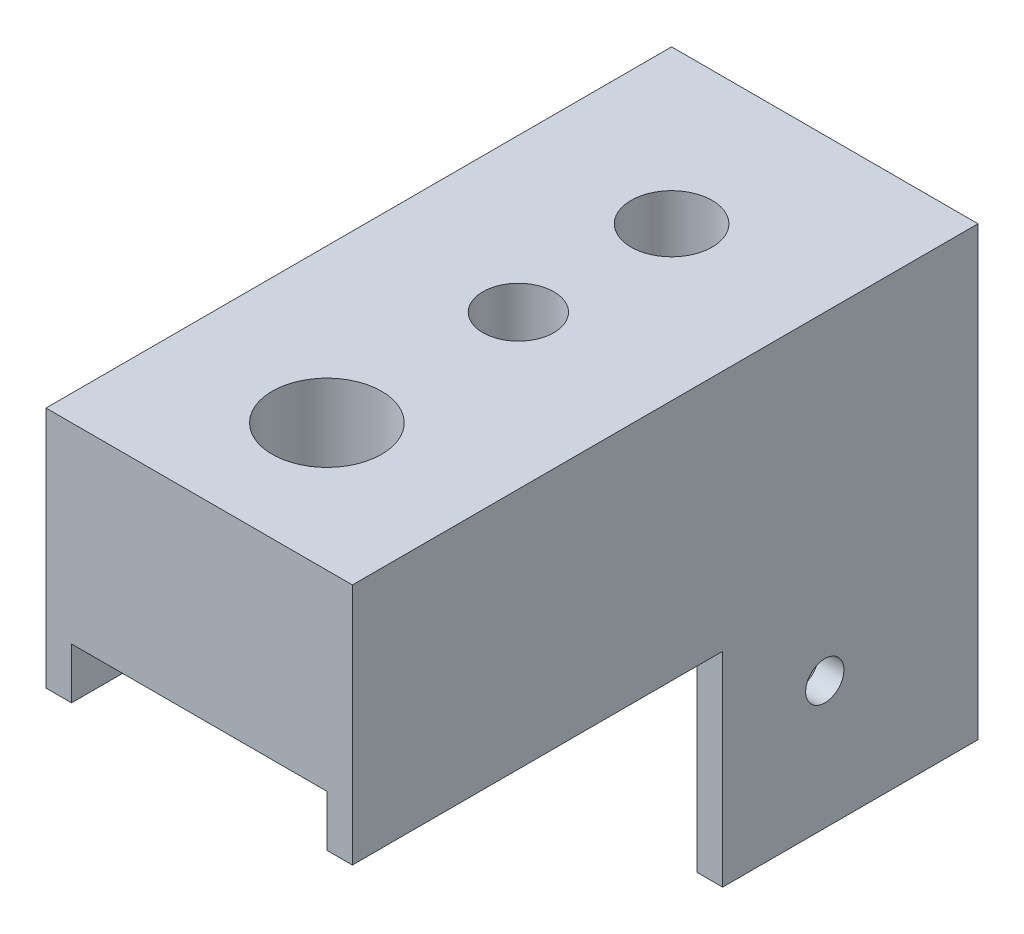
ISO-10303-21;
HEADER;
FILE_DESCRIPTION(('STEP AP214'),'2;1');
FILE_NAME('part.step','',(''),(''),'','','');
FILE_SCHEMA(('AUTOMOTIVE_DESIGN { 1 0 10303 214 1 1 1 1 }'));
ENDSEC;
DATA;
#1=APPLICATION_CONTEXT('core data for automotive mechanical design processes');
#2=APPLICATION_PROTOCOL_DEFINITION('international standard','automotive_design',2000,#1);
#3=PRODUCT_CONTEXT('',#1,'mechanical');
#4=PRODUCT('Part','Part','',(#3));
#5=PRODUCT_RELATED_PRODUCT_CATEGORY('part','',(#4));
#6=PRODUCT_DEFINITION_FORMATION('','',#4);
#7=PRODUCT_DEFINITION_CONTEXT('part definition',#1,'design');
#8=PRODUCT_DEFINITION('design','',#6,#7);
#9=PRODUCT_DEFINITION_SHAPE('','',#8);
#10=(LENGTH_UNIT() NAMED_UNIT(*) SI_UNIT(.MILLI.,.METRE.));
#11=(NAMED_UNIT(*) PLANE_ANGLE_UNIT() SI_UNIT($,.RADIAN.));
#12=(NAMED_UNIT(*) SI_UNIT($,.STERADIAN.) SOLID_ANGLE_UNIT());
#13=UNCERTAINTY_MEASURE_WITH_UNIT(LENGTH_MEASURE(1.E-05),#10,'distance_accuracy_value','');
#14=(GEOMETRIC_REPRESENTATION_CONTEXT(3) GLOBAL_UNCERTAINTY_ASSIGNED_CONTEXT((#13)) GLOBAL_UNIT_ASSIGNED_CONTEXT((#10,
#11,#12)) REPRESENTATION_CONTEXT('',''));
#15=CARTESIAN_POINT('',(0.,0.,0.));
#16=DIRECTION('',(0.,0.,1.));
#17=DIRECTION('',(1.,0.,0.));
#18=AXIS2_PLACEMENT_3D('',#15,#16,#17);
#19=CARTESIAN_POINT('',(10.,0.,44.));
#20=DIRECTION('',(0.,0.,-1.));
#21=DIRECTION('',(-1.,0.,0.));
#22=AXIS2_PLACEMENT_3D('',#19,#20,#21);
#23=PLANE('',#22);
#24=DIRECTION('',(-1.,0.,0.));
#25=VECTOR('',#24,1.);
#26=CARTESIAN_POINT('',(10.,15.,44.));
#27=LINE('',#26,#25);
#28=CARTESIAN_POINT('',(12.,15.,44.));
#29=VERTEX_POINT('',#28);
#30=CARTESIAN_POINT('',(-12.,15.,44.));
#31=VERTEX_POINT('',#30);
#32=EDGE_CURVE('E142',#29,#31,#27,.T.);
#33=ORIENTED_EDGE('',*,*,#32,.T.);
#34=DIRECTION('',(0.,-1.,0.));
#35=VECTOR('',#34,1.);
#36=CARTESIAN_POINT('',(-12.,15.,44.));
#37=LINE('',#36,#35);
#38=CARTESIAN_POINT('',(-12.,-4.,44.));
#39=VERTEX_POINT('',#38);
#40=EDGE_CURVE('E134',#31,#39,#37,.T.);
#41=ORIENTED_EDGE('',*,*,#40,.T.);
#42=DIRECTION('',(1.,0.,0.));
#43=VECTOR('',#42,1.);
#44=CARTESIAN_POINT('',(-12.,-4.,44.));
#45=LINE('',#44,#43);
#46=CARTESIAN_POINT('',(-10.,-4.,44.));
#47=VERTEX_POINT('',#46);
#48=EDGE_CURVE('E117',#39,#47,#45,.T.);
#49=ORIENTED_EDGE('',*,*,#48,.T.);
#50=DIRECTION('',(0.,-1.,0.));
#51=VECTOR('',#50,1.);
#52=CARTESIAN_POINT('',(-10.,15.,44.));
#53=LINE('',#52,#51);
#54=CARTESIAN_POINT('',(-10.,0.,44.));
#55=VERTEX_POINT('',#54);
#56=EDGE_CURVE('E157',#55,#47,#53,.T.);
#57=ORIENTED_EDGE('',*,*,#56,.F.);
#58=DIRECTION('',(-1.,0.,0.));
#59=VECTOR('',#58,1.);
#60=CARTESIAN_POINT('',(10.,0.,44.));
#61=LINE('',#60,#59);
#62=CARTESIAN_POINT('',(10.,0.,44.));
#63=VERTEX_POINT('',#62);
#64=EDGE_CURVE('E11',#63,#55,#61,.T.);
#65=ORIENTED_EDGE('',*,*,#64,.F.);
#66=DIRECTION('',(0.,-1.,0.));
#67=VECTOR('',#66,1.);
#68=CARTESIAN_POINT('',(10.,15.,44.));
#69=LINE('',#68,#67);
#70=CARTESIAN_POINT('',(10.,-4.,44.));
#71=VERTEX_POINT('',#70);
#72=EDGE_CURVE('E170',#63,#71,#69,.T.);
#73=ORIENTED_EDGE('',*,*,#72,.T.);
#74=DIRECTION('',(-1.,0.,0.));
#75=VECTOR('',#74,1.);
#76=CARTESIAN_POINT('',(12.,-4.,44.));
#77=LINE('',#76,#75);
#78=CARTESIAN_POINT('',(12.,-4.,44.));
#79=VERTEX_POINT('',#78);
#80=EDGE_CURVE('E183',#79,#71,#77,.T.);
#81=ORIENTED_EDGE('',*,*,#80,.F.);
#82=DIRECTION('',(0.,-1.,0.));
#83=VECTOR('',#82,1.);
#84=CARTESIAN_POINT('',(12.,15.,44.));
#85=LINE('',#84,#83);
#86=EDGE_CURVE('E181',#29,#79,#85,.T.);
#87=ORIENTED_EDGE('',*,*,#86,.F.);
#88=EDGE_LOOP('',(#33,#41,#49,#57,#65,#73,#81,#87));
#89=FACE_BOUND('',#88,.T.);
#90=ADVANCED_FACE('F33',(#89),#23,.F.);
#91=CARTESIAN_POINT('',(10.,0.,44.));
#92=DIRECTION('',(0.,1.,0.));
#93=DIRECTION('',(0.,0.,1.));
#94=AXIS2_PLACEMENT_3D('',#91,#92,#93);
#95=PLANE('',#94);
#96=CARTESIAN_POINT('',(0.,0.,34.));
#97=DIRECTION('',(0.,-1.,0.));
#98=DIRECTION('',(0.,0.,-1.));
#99=AXIS2_PLACEMENT_3D('',#96,#97,#98);
#100=CIRCLE('',#99,4.285);
#101=CARTESIAN_POINT('',(0.,0.,29.715));
#102=VERTEX_POINT('',#101);
#103=EDGE_CURVE('E313',#102,#102,#100,.T.);
#104=ORIENTED_EDGE('',*,*,#103,.F.);
#105=EDGE_LOOP('',(#104));
#106=FACE_BOUND('',#105,.T.);
#107=CARTESIAN_POINT('',(0.,0.,19.));
#108=DIRECTION('',(0.,-1.,0.));
#109=DIRECTION('',(0.,0.,-1.));
#110=AXIS2_PLACEMENT_3D('',#107,#108,#109);
#111=CIRCLE('',#110,2.78);
#112=CARTESIAN_POINT('',(0.,0.,16.22));
#113=VERTEX_POINT('',#112);
#114=EDGE_CURVE('E319',#113,#113,#111,.T.);
#115=ORIENTED_EDGE('',*,*,#114,.F.);
#116=EDGE_LOOP('',(#115));
#117=FACE_BOUND('',#116,.T.);
#118=CARTESIAN_POINT('',(0.,0.,7.));
#119=DIRECTION('',(0.,-1.,0.));
#120=DIRECTION('',(0.,0.,-1.));
#121=AXIS2_PLACEMENT_3D('',#118,#119,#120);
#122=CIRCLE('',#121,3.175);
#123=CARTESIAN_POINT('',(0.,0.,3.825));
#124=VERTEX_POINT('',#123);
#125=EDGE_CURVE('E310',#124,#124,#122,.T.);
#126=ORIENTED_EDGE('',*,*,#125,.F.);
#127=EDGE_LOOP('',(#126));
#128=FACE_BOUND('',#127,.T.);
#129=DIRECTION('',(0.,0.,-1.));
#130=VECTOR('',#129,1.);
#131=CARTESIAN_POINT('',(-10.,0.,44.));
#132=LINE('',#131,#130);
#133=CARTESIAN_POINT('',(-10.,0.,0.));
#134=VERTEX_POINT('',#133);
#135=EDGE_CURVE('E200',#55,#134,#132,.T.);
#136=ORIENTED_EDGE('',*,*,#135,.T.);
#137=DIRECTION('',(-1.,0.,0.));
#138=VECTOR('',#137,1.);
#139=CARTESIAN_POINT('',(10.,0.,0.));
#140=LINE('',#139,#138);
#141=CARTESIAN_POINT('',(10.,0.,0.));
#142=VERTEX_POINT('',#141);
#143=EDGE_CURVE('E41',#142,#134,#140,.T.);
#144=ORIENTED_EDGE('',*,*,#143,.F.);
#145=DIRECTION('',(0.,0.,-1.));
#146=VECTOR('',#145,1.);
#147=CARTESIAN_POINT('',(10.,0.,44.));
#148=LINE('',#147,#146);
#149=EDGE_CURVE('E201',#63,#142,#148,.T.);
#150=ORIENTED_EDGE('',*,*,#149,.F.);
#151=ORIENTED_EDGE('',*,*,#64,.T.);
#152=EDGE_LOOP('',(#136,#144,#150,#151));
#153=FACE_BOUND('',#152,.T.);
#154=ADVANCED_FACE('F224',(#106,#117,#128,#153),#95,.F.);
#155=CARTESIAN_POINT('',(10.,0.,0.));
#156=DIRECTION('',(0.,0.,-1.));
#157=DIRECTION('',(0.,1.,0.));
#158=AXIS2_PLACEMENT_3D('',#155,#156,#157);
#159=PLANE('',#158);
#160=DIRECTION('',(0.,-1.,0.));
#161=VECTOR('',#160,1.);
#162=CARTESIAN_POINT('',(-10.,0.,0.));
#163=LINE('',#162,#161);
#164=CARTESIAN_POINT('',(-10.,-20.,0.));
#165=VERTEX_POINT('',#164);
#166=EDGE_CURVE('E205',#134,#165,#163,.T.);
#167=ORIENTED_EDGE('',*,*,#166,.T.);
#168=DIRECTION('',(-1.,0.,0.));
#169=VECTOR('',#168,1.);
#170=CARTESIAN_POINT('',(10.,-20.,0.));
#171=LINE('',#170,#169);
#172=CARTESIAN_POINT('',(10.,-20.,0.));
#173=VERTEX_POINT('',#172);
#174=EDGE_CURVE('E216',#173,#165,#171,.T.);
#175=ORIENTED_EDGE('',*,*,#174,.F.);
#176=DIRECTION('',(0.,-1.,0.));
#177=VECTOR('',#176,1.);
#178=CARTESIAN_POINT('',(10.,0.,0.));
#179=LINE('',#178,#177);
#180=EDGE_CURVE('E204',#142,#173,#179,.T.);
#181=ORIENTED_EDGE('',*,*,#180,.F.);
#182=ORIENTED_EDGE('',*,*,#143,.T.);
#183=EDGE_LOOP('',(#167,#175,#181,#182));
#184=FACE_BOUND('',#183,.T.);
#185=ADVANCED_FACE('F219',(#184),#159,.F.);
#186=CARTESIAN_POINT('',(10.,-20.,-5.));
#187=DIRECTION('',(0.,1.,0.));
#188=DIRECTION('',(0.,0.,1.));
#189=AXIS2_PLACEMENT_3D('',#186,#187,#188);
#190=PLANE('',#189);
#191=ORIENTED_EDGE('',*,*,#174,.T.);
#192=DIRECTION('',(0.,0.,-1.));
#193=VECTOR('',#192,1.);
#194=CARTESIAN_POINT('',(-10.,-20.,15.));
#195=LINE('',#194,#193);
#196=CARTESIAN_POINT('',(-10.,-20.,15.));
#197=VERTEX_POINT('',#196);
#198=EDGE_CURVE('E160',#197,#165,#195,.T.);
#199=ORIENTED_EDGE('',*,*,#198,.F.);
#200=DIRECTION('',(1.,0.,0.));
#201=VECTOR('',#200,1.);
#202=CARTESIAN_POINT('',(-12.,-20.,15.));
#203=LINE('',#202,#201);
#204=CARTESIAN_POINT('',(-12.,-20.,15.));
#205=VERTEX_POINT('',#204);
#206=EDGE_CURVE('E128',#205,#197,#203,.T.);
#207=ORIENTED_EDGE('',*,*,#206,.F.);
#208=DIRECTION('',(0.,0.,-1.));
#209=VECTOR('',#208,1.);
#210=CARTESIAN_POINT('',(-12.,-20.,15.));
#211=LINE('',#210,#209);
#212=CARTESIAN_POINT('',(-12.,-20.,-5.));
#213=VERTEX_POINT('',#212);
#214=EDGE_CURVE('E151',#205,#213,#211,.T.);
#215=ORIENTED_EDGE('',*,*,#214,.T.);
#216=DIRECTION('',(-1.,0.,0.));
#217=VECTOR('',#216,1.);
#218=CARTESIAN_POINT('',(10.,-20.,-5.));
#219=LINE('',#218,#217);
#220=CARTESIAN_POINT('',(12.,-20.,-5.));
#221=VERTEX_POINT('',#220);
#222=EDGE_CURVE('E214',#221,#213,#219,.T.);
#223=ORIENTED_EDGE('',*,*,#222,.F.);
#224=DIRECTION('',(0.,0.,-1.));
#225=VECTOR('',#224,1.);
#226=CARTESIAN_POINT('',(12.,-20.,15.));
#227=LINE('',#226,#225);
#228=CARTESIAN_POINT('',(12.,-20.,15.));
#229=VERTEX_POINT('',#228);
#230=EDGE_CURVE('E172',#229,#221,#227,.T.);
#231=ORIENTED_EDGE('',*,*,#230,.F.);
#232=DIRECTION('',(-1.,0.,0.));
#233=VECTOR('',#232,1.);
#234=CARTESIAN_POINT('',(12.,-20.,15.));
#235=LINE('',#234,#233);
#236=CARTESIAN_POINT('',(10.,-20.,15.));
#237=VERTEX_POINT('',#236);
#238=EDGE_CURVE('E194',#229,#237,#235,.T.);
#239=ORIENTED_EDGE('',*,*,#238,.T.);
#240=DIRECTION('',(0.,0.,-1.));
#241=VECTOR('',#240,1.);
#242=CARTESIAN_POINT('',(10.,-20.,15.));
#243=LINE('',#242,#241);
#244=EDGE_CURVE('E188',#237,#173,#243,.T.);
#245=ORIENTED_EDGE('',*,*,#244,.T.);
#246=EDGE_LOOP('',(#191,#199,#207,#215,#223,#231,#239,#245));
#247=FACE_BOUND('',#246,.T.);
#248=ADVANCED_FACE('F247',(#247),#190,.F.);
#249=CARTESIAN_POINT('',(10.,15.,-5.));
#250=DIRECTION('',(0.,0.,1.));
#251=DIRECTION('',(0.,-1.,0.));
#252=AXIS2_PLACEMENT_3D('',#249,#250,#251);
#253=PLANE('',#252);
#254=ORIENTED_EDGE('',*,*,#222,.T.);
#255=DIRECTION('',(0.,1.,0.));
#256=VECTOR('',#255,1.);
#257=CARTESIAN_POINT('',(-12.,15.,-5.));
#258=LINE('',#257,#256);
#259=CARTESIAN_POINT('',(-12.,15.,-5.));
#260=VERTEX_POINT('',#259);
#261=EDGE_CURVE('E145',#213,#260,#258,.T.);
#262=ORIENTED_EDGE('',*,*,#261,.T.);
#263=DIRECTION('',(-1.,0.,0.));
#264=VECTOR('',#263,1.);
#265=CARTESIAN_POINT('',(10.,15.,-5.));
#266=LINE('',#265,#264);
#267=CARTESIAN_POINT('',(12.,15.,-5.));
#268=VERTEX_POINT('',#267);
#269=EDGE_CURVE('E212',#268,#260,#266,.T.);
#270=ORIENTED_EDGE('',*,*,#269,.F.);
#271=DIRECTION('',(0.,1.,0.));
#272=VECTOR('',#271,1.);
#273=CARTESIAN_POINT('',(12.,15.,-5.));
#274=LINE('',#273,#272);
#275=EDGE_CURVE('E175',#221,#268,#274,.T.);
#276=ORIENTED_EDGE('',*,*,#275,.F.);
#277=EDGE_LOOP('',(#254,#262,#270,#276));
#278=FACE_BOUND('',#277,.T.);
#279=ADVANCED_FACE('F244',(#278),#253,.F.);
#280=CARTESIAN_POINT('',(10.,15.,44.));
#281=DIRECTION('',(0.,-1.,0.));
#282=DIRECTION('',(0.,0.,-1.));
#283=AXIS2_PLACEMENT_3D('',#280,#281,#282);
#284=PLANE('',#283);
#285=CARTESIAN_POINT('',(0.,15.,34.));
#286=DIRECTION('',(0.,-1.,0.));
#287=DIRECTION('',(0.,0.,-1.));
#288=AXIS2_PLACEMENT_3D('',#285,#286,#287);
#289=CIRCLE('',#288,4.285);
#290=CARTESIAN_POINT('',(0.,15.,29.715));
#291=VERTEX_POINT('',#290);
#292=EDGE_CURVE('E158',#291,#291,#289,.T.);
#293=ORIENTED_EDGE('',*,*,#292,.T.);
#294=EDGE_LOOP('',(#293));
#295=FACE_BOUND('',#294,.T.);
#296=CARTESIAN_POINT('',(0.,15.,19.));
#297=DIRECTION('',(0.,-1.,0.));
#298=DIRECTION('',(0.,0.,-1.));
#299=AXIS2_PLACEMENT_3D('',#296,#297,#298);
#300=CIRCLE('',#299,2.78);
#301=CARTESIAN_POINT('',(0.,15.,16.22));
#302=VERTEX_POINT('',#301);
#303=EDGE_CURVE('E316',#302,#302,#300,.T.);
#304=ORIENTED_EDGE('',*,*,#303,.T.);
#305=EDGE_LOOP('',(#304));
#306=FACE_BOUND('',#305,.T.);
#307=CARTESIAN_POINT('',(0.,15.,7.));
#308=DIRECTION('',(0.,-1.,0.));
#309=DIRECTION('',(0.,0.,-1.));
#310=AXIS2_PLACEMENT_3D('',#307,#308,#309);
#311=CIRCLE('',#310,3.175);
#312=CARTESIAN_POINT('',(0.,15.,3.825));
#313=VERTEX_POINT('',#312);
#314=EDGE_CURVE('E322',#313,#313,#311,.T.);
#315=ORIENTED_EDGE('',*,*,#314,.T.);
#316=EDGE_LOOP('',(#315));
#317=FACE_BOUND('',#316,.T.);
#318=ORIENTED_EDGE('',*,*,#269,.T.);
#319=DIRECTION('',(0.,0.,1.));
#320=VECTOR('',#319,1.);
#321=CARTESIAN_POINT('',(-12.,15.,44.));
#322=LINE('',#321,#320);
#323=EDGE_CURVE('E143',#260,#31,#322,.T.);
#324=ORIENTED_EDGE('',*,*,#323,.T.);
#325=ORIENTED_EDGE('',*,*,#32,.F.);
#326=DIRECTION('',(0.,0.,1.));
#327=VECTOR('',#326,1.);
#328=CARTESIAN_POINT('',(12.,15.,44.));
#329=LINE('',#328,#327);
#330=EDGE_CURVE('E178',#268,#29,#329,.T.);
#331=ORIENTED_EDGE('',*,*,#330,.F.);
#332=EDGE_LOOP('',(#318,#324,#325,#331));
#333=FACE_BOUND('',#332,.T.);
#334=ADVANCED_FACE('F241',(#295,#306,#317,#333),#284,.F.);
#335=CARTESIAN_POINT('',(12.,-4.,44.));
#336=DIRECTION('',(0.,1.,0.));
#337=DIRECTION('',(0.,0.,1.));
#338=AXIS2_PLACEMENT_3D('',#335,#336,#337);
#339=PLANE('',#338);
#340=DIRECTION('',(0.,0.,-1.));
#341=VECTOR('',#340,1.);
#342=CARTESIAN_POINT('',(10.,-4.,44.));
#343=LINE('',#342,#341);
#344=CARTESIAN_POINT('',(10.,-4.,15.));
#345=VERTEX_POINT('',#344);
#346=EDGE_CURVE('E127',#71,#345,#343,.T.);
#347=ORIENTED_EDGE('',*,*,#346,.T.);
#348=DIRECTION('',(-1.,0.,0.));
#349=VECTOR('',#348,1.);
#350=CARTESIAN_POINT('',(12.,-4.,15.));
#351=LINE('',#350,#349);
#352=CARTESIAN_POINT('',(12.,-4.,15.));
#353=VERTEX_POINT('',#352);
#354=EDGE_CURVE('E197',#353,#345,#351,.T.);
#355=ORIENTED_EDGE('',*,*,#354,.F.);
#356=DIRECTION('',(0.,0.,-1.));
#357=VECTOR('',#356,1.);
#358=CARTESIAN_POINT('',(12.,-4.,44.));
#359=LINE('',#358,#357);
#360=EDGE_CURVE('E166',#79,#353,#359,.T.);
#361=ORIENTED_EDGE('',*,*,#360,.F.);
#362=ORIENTED_EDGE('',*,*,#80,.T.);
#363=EDGE_LOOP('',(#347,#355,#361,#362));
#364=FACE_BOUND('',#363,.T.);
#365=ADVANCED_FACE('F234',(#364),#339,.F.);
#366=CARTESIAN_POINT('',(12.,-4.,15.));
#367=DIRECTION('',(0.,0.,-1.));
#368=DIRECTION('',(0.,1.,0.));
#369=AXIS2_PLACEMENT_3D('',#366,#367,#368);
#370=PLANE('',#369);
#371=DIRECTION('',(0.,-1.,0.));
#372=VECTOR('',#371,1.);
#373=CARTESIAN_POINT('',(10.,-4.,15.));
#374=LINE('',#373,#372);
#375=EDGE_CURVE('E186',#345,#237,#374,.T.);
#376=ORIENTED_EDGE('',*,*,#375,.T.);
#377=ORIENTED_EDGE('',*,*,#238,.F.);
#378=DIRECTION('',(0.,-1.,0.));
#379=VECTOR('',#378,1.);
#380=CARTESIAN_POINT('',(12.,-4.,15.));
#381=LINE('',#380,#379);
#382=EDGE_CURVE('E169',#353,#229,#381,.T.);
#383=ORIENTED_EDGE('',*,*,#382,.F.);
#384=ORIENTED_EDGE('',*,*,#354,.T.);
#385=EDGE_LOOP('',(#376,#377,#383,#384));
#386=FACE_BOUND('',#385,.T.);
#387=ADVANCED_FACE('F250',(#386),#370,.F.);
#388=CARTESIAN_POINT('',(12.,0.,0.));
#389=DIRECTION('',(-1.,0.,0.));
#390=DIRECTION('',(0.,0.,1.));
#391=AXIS2_PLACEMENT_3D('',#388,#389,#390);
#392=PLANE('',#391);
#393=CARTESIAN_POINT('',(12.,-9.99999999999999,7.));
#394=DIRECTION('',(-1.,0.,0.));
#395=DIRECTION('',(0.,0.,1.));
#396=AXIS2_PLACEMENT_3D('',#393,#394,#395);
#397=CIRCLE('',#396,1.5);
#398=CARTESIAN_POINT('',(12.,-9.99999999999999,8.5));
#399=VERTEX_POINT('',#398);
#400=EDGE_CURVE('E297',#399,#399,#397,.T.);
#401=ORIENTED_EDGE('',*,*,#400,.T.);
#402=EDGE_LOOP('',(#401));
#403=FACE_BOUND('',#402,.T.);
#404=ORIENTED_EDGE('',*,*,#360,.T.);
#405=ORIENTED_EDGE('',*,*,#382,.T.);
#406=ORIENTED_EDGE('',*,*,#230,.T.);
#407=ORIENTED_EDGE('',*,*,#275,.T.);
#408=ORIENTED_EDGE('',*,*,#330,.T.);
#409=ORIENTED_EDGE('',*,*,#86,.T.);
#410=EDGE_LOOP('',(#404,#405,#406,#407,#408,#409));
#411=FACE_BOUND('',#410,.T.);
#412=ADVANCED_FACE('F237',(#403,#411),#392,.F.);
#413=CARTESIAN_POINT('',(10.,0.,0.));
#414=DIRECTION('',(-1.,0.,0.));
#415=DIRECTION('',(0.,0.,1.));
#416=AXIS2_PLACEMENT_3D('',#413,#414,#415);
#417=PLANE('',#416);
#418=CARTESIAN_POINT('',(10.,-9.99999999999999,7.));
#419=DIRECTION('',(-1.,0.,0.));
#420=DIRECTION('',(0.,0.,1.));
#421=AXIS2_PLACEMENT_3D('',#418,#419,#420);
#422=CIRCLE('',#421,1.5);
#423=CARTESIAN_POINT('',(10.,-9.99999999999999,8.5));
#424=VERTEX_POINT('',#423);
#425=EDGE_CURVE('E307',#424,#424,#422,.F.);
#426=ORIENTED_EDGE('',*,*,#425,.T.);
#427=EDGE_LOOP('',(#426));
#428=FACE_BOUND('',#427,.T.);
#429=ORIENTED_EDGE('',*,*,#72,.F.);
#430=ORIENTED_EDGE('',*,*,#149,.T.);
#431=ORIENTED_EDGE('',*,*,#180,.T.);
#432=ORIENTED_EDGE('',*,*,#244,.F.);
#433=ORIENTED_EDGE('',*,*,#375,.F.);
#434=ORIENTED_EDGE('',*,*,#346,.F.);
#435=EDGE_LOOP('',(#429,#430,#431,#432,#433,#434));
#436=FACE_BOUND('',#435,.T.);
#437=ADVANCED_FACE('F230',(#428,#436),#417,.T.);
#438=CARTESIAN_POINT('',(-10.,0.,0.));
#439=DIRECTION('',(1.,0.,0.));
#440=DIRECTION('',(0.,0.,1.));
#441=AXIS2_PLACEMENT_3D('',#438,#439,#440);
#442=PLANE('',#441);
#443=CARTESIAN_POINT('',(-10.,-9.99999999999999,7.));
#444=DIRECTION('',(1.,0.,0.));
#445=DIRECTION('',(0.,0.,-1.));
#446=AXIS2_PLACEMENT_3D('',#443,#444,#445);
#447=CIRCLE('',#446,1.5);
#448=CARTESIAN_POINT('',(-10.,-9.99999999999999,5.49999999999999));
#449=VERTEX_POINT('',#448);
#450=EDGE_CURVE('E302',#449,#449,#447,.F.);
#451=ORIENTED_EDGE('',*,*,#450,.T.);
#452=EDGE_LOOP('',(#451));
#453=FACE_BOUND('',#452,.T.);
#454=ORIENTED_EDGE('',*,*,#166,.F.);
#455=ORIENTED_EDGE('',*,*,#135,.F.);
#456=ORIENTED_EDGE('',*,*,#56,.T.);
#457=DIRECTION('',(0.,0.,-1.));
#458=VECTOR('',#457,1.);
#459=CARTESIAN_POINT('',(-10.,-4.,44.));
#460=LINE('',#459,#458);
#461=CARTESIAN_POINT('',(-10.,-4.,15.));
#462=VERTEX_POINT('',#461);
#463=EDGE_CURVE('E123',#47,#462,#460,.T.);
#464=ORIENTED_EDGE('',*,*,#463,.T.);
#465=DIRECTION('',(0.,-1.,0.));
#466=VECTOR('',#465,1.);
#467=CARTESIAN_POINT('',(-10.,-4.,15.));
#468=LINE('',#467,#466);
#469=EDGE_CURVE('E139',#462,#197,#468,.T.);
#470=ORIENTED_EDGE('',*,*,#469,.T.);
#471=ORIENTED_EDGE('',*,*,#198,.T.);
#472=EDGE_LOOP('',(#454,#455,#456,#464,#470,#471));
#473=FACE_BOUND('',#472,.T.);
#474=ADVANCED_FACE('F222',(#453,#473),#442,.T.);
#475=CARTESIAN_POINT('',(-12.,-4.,44.));
#476=DIRECTION('',(0.,-1.,0.));
#477=DIRECTION('',(0.,0.,-1.));
#478=AXIS2_PLACEMENT_3D('',#475,#476,#477);
#479=PLANE('',#478);
#480=ORIENTED_EDGE('',*,*,#463,.F.);
#481=ORIENTED_EDGE('',*,*,#48,.F.);
#482=DIRECTION('',(0.,0.,-1.));
#483=VECTOR('',#482,1.);
#484=CARTESIAN_POINT('',(-12.,-4.,44.));
#485=LINE('',#484,#483);
#486=CARTESIAN_POINT('',(-12.,-4.,15.));
#487=VERTEX_POINT('',#486);
#488=EDGE_CURVE('E120',#39,#487,#485,.T.);
#489=ORIENTED_EDGE('',*,*,#488,.T.);
#490=DIRECTION('',(1.,0.,0.));
#491=VECTOR('',#490,1.);
#492=CARTESIAN_POINT('',(-12.,-4.,15.));
#493=LINE('',#492,#491);
#494=EDGE_CURVE('E155',#487,#462,#493,.T.);
#495=ORIENTED_EDGE('',*,*,#494,.T.);
#496=EDGE_LOOP('',(#480,#481,#489,#495));
#497=FACE_BOUND('',#496,.T.);
#498=ADVANCED_FACE('F119',(#497),#479,.T.);
#499=CARTESIAN_POINT('',(-12.,-4.,15.));
#500=DIRECTION('',(0.,0.,1.));
#501=DIRECTION('',(0.,-1.,0.));
#502=AXIS2_PLACEMENT_3D('',#499,#500,#501);
#503=PLANE('',#502);
#504=ORIENTED_EDGE('',*,*,#469,.F.);
#505=ORIENTED_EDGE('',*,*,#494,.F.);
#506=DIRECTION('',(0.,-1.,0.));
#507=VECTOR('',#506,1.);
#508=CARTESIAN_POINT('',(-12.,-4.,15.));
#509=LINE('',#508,#507);
#510=EDGE_CURVE('E138',#487,#205,#509,.T.);
#511=ORIENTED_EDGE('',*,*,#510,.T.);
#512=ORIENTED_EDGE('',*,*,#206,.T.);
#513=EDGE_LOOP('',(#504,#505,#511,#512));
#514=FACE_BOUND('',#513,.T.);
#515=ADVANCED_FACE('F253',(#514),#503,.T.);
#516=CARTESIAN_POINT('',(-12.,0.,0.));
#517=DIRECTION('',(1.,0.,0.));
#518=DIRECTION('',(0.,0.,1.));
#519=AXIS2_PLACEMENT_3D('',#516,#517,#518);
#520=PLANE('',#519);
#521=CARTESIAN_POINT('',(-12.,-9.99999999999999,7.));
#522=DIRECTION('',(-1.,0.,0.));
#523=DIRECTION('',(0.,0.,1.));
#524=AXIS2_PLACEMENT_3D('',#521,#522,#523);
#525=CIRCLE('',#524,1.5);
#526=CARTESIAN_POINT('',(-12.,-9.99999999999999,8.5));
#527=VERTEX_POINT('',#526);
#528=EDGE_CURVE('E299',#527,#527,#525,.T.);
#529=ORIENTED_EDGE('',*,*,#528,.F.);
#530=EDGE_LOOP('',(#529));
#531=FACE_BOUND('',#530,.T.);
#532=ORIENTED_EDGE('',*,*,#488,.F.);
#533=ORIENTED_EDGE('',*,*,#40,.F.);
#534=ORIENTED_EDGE('',*,*,#323,.F.);
#535=ORIENTED_EDGE('',*,*,#261,.F.);
#536=ORIENTED_EDGE('',*,*,#214,.F.);
#537=ORIENTED_EDGE('',*,*,#510,.F.);
#538=EDGE_LOOP('',(#532,#533,#534,#535,#536,#537));
#539=FACE_BOUND('',#538,.T.);
#540=ADVANCED_FACE('F132',(#531,#539),#520,.F.);
#541=CARTESIAN_POINT('',(0.,15.,7.));
#542=DIRECTION('',(0.,-1.,0.));
#543=DIRECTION('',(0.,0.,-1.));
#544=AXIS2_PLACEMENT_3D('',#541,#542,#543);
#545=CYLINDRICAL_SURFACE('',#544,3.175);
#546=ORIENTED_EDGE('',*,*,#314,.F.);
#547=EDGE_LOOP('',(#546));
#548=FACE_BOUND('',#547,.T.);
#549=ORIENTED_EDGE('',*,*,#125,.T.);
#550=EDGE_LOOP('',(#549));
#551=FACE_BOUND('',#550,.T.);
#552=ADVANCED_FACE('F260',(#548,#551),#545,.F.);
#553=CARTESIAN_POINT('',(0.,15.,19.));
#554=DIRECTION('',(0.,-1.,0.));
#555=DIRECTION('',(0.,0.,-1.));
#556=AXIS2_PLACEMENT_3D('',#553,#554,#555);
#557=CYLINDRICAL_SURFACE('',#556,2.78);
#558=ORIENTED_EDGE('',*,*,#303,.F.);
#559=EDGE_LOOP('',(#558));
#560=FACE_BOUND('',#559,.T.);
#561=ORIENTED_EDGE('',*,*,#114,.T.);
#562=EDGE_LOOP('',(#561));
#563=FACE_BOUND('',#562,.T.);
#564=ADVANCED_FACE('F329',(#560,#563),#557,.F.);
#565=CARTESIAN_POINT('',(0.,15.,34.));
#566=DIRECTION('',(0.,-1.,0.));
#567=DIRECTION('',(0.,0.,-1.));
#568=AXIS2_PLACEMENT_3D('',#565,#566,#567);
#569=CYLINDRICAL_SURFACE('',#568,4.285);
#570=ORIENTED_EDGE('',*,*,#292,.F.);
#571=EDGE_LOOP('',(#570));
#572=FACE_BOUND('',#571,.T.);
#573=ORIENTED_EDGE('',*,*,#103,.T.);
#574=EDGE_LOOP('',(#573));
#575=FACE_BOUND('',#574,.T.);
#576=ADVANCED_FACE('F335',(#572,#575),#569,.F.);
#577=CARTESIAN_POINT('',(-12.,-9.99999999999999,7.));
#578=DIRECTION('',(1.,0.,0.));
#579=DIRECTION('',(0.,0.,-1.));
#580=AXIS2_PLACEMENT_3D('',#577,#578,#579);
#581=CYLINDRICAL_SURFACE('',#580,1.5);
#582=ORIENTED_EDGE('',*,*,#450,.F.);
#583=EDGE_LOOP('',(#582));
#584=FACE_BOUND('',#583,.T.);
#585=ORIENTED_EDGE('',*,*,#528,.T.);
#586=EDGE_LOOP('',(#585));
#587=FACE_BOUND('',#586,.T.);
#588=ADVANCED_FACE('F346',(#584,#587),#581,.F.);
#589=ORIENTED_EDGE('',*,*,#425,.F.);
#590=EDGE_LOOP('',(#589));
#591=FACE_BOUND('',#590,.T.);
#592=ORIENTED_EDGE('',*,*,#400,.F.);
#593=EDGE_LOOP('',(#592));
#594=FACE_BOUND('',#593,.T.);
#595=ADVANCED_FACE('F349',(#591,#594),#581,.F.);
#596=CLOSED_SHELL('',(#90,#154,#185,#248,#279,#334,#365,#387,#412,#437,#474,#498,#515,#540,#552,
#564,#576,#588,#595));
#597=MANIFOLD_SOLID_BREP('B2',#596);
#598=ADVANCED_BREP_SHAPE_REPRESENTATION('',(#18,#597),#14);
#599=SHAPE_DEFINITION_REPRESENTATION(#9,#598);
ENDSEC;
END-ISO-10303-21;
